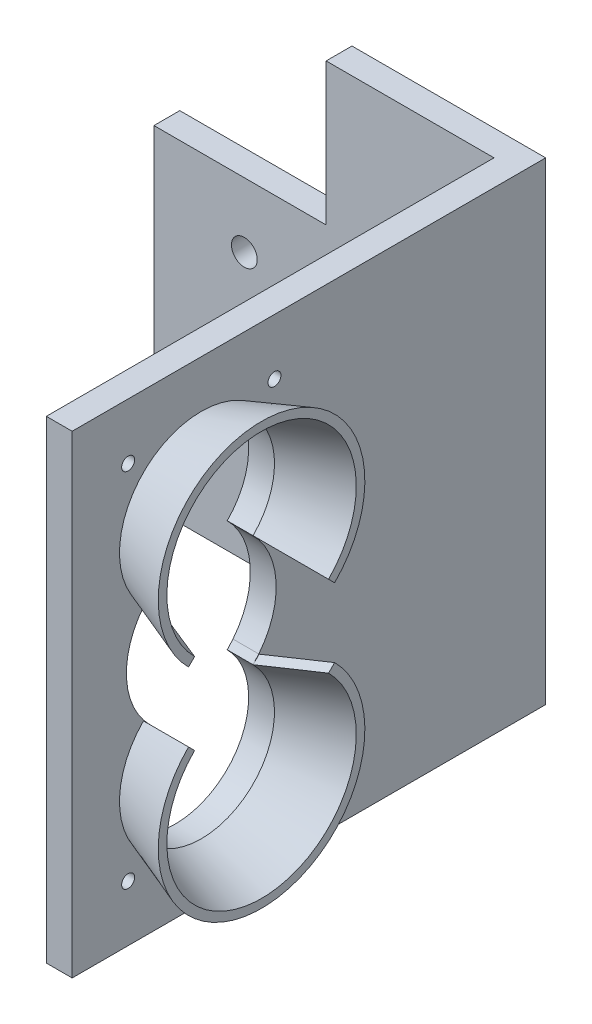
ISO-10303-21;
HEADER;
FILE_DESCRIPTION(('STEP AP214'),'2;1');
FILE_NAME('part.step','',(''),(''),'','','');
FILE_SCHEMA(('AUTOMOTIVE_DESIGN { 1 0 10303 214 1 1 1 1 }'));
ENDSEC;
DATA;
#1=APPLICATION_CONTEXT('core data for automotive mechanical design processes');
#2=APPLICATION_PROTOCOL_DEFINITION('international standard','automotive_design',2000,#1);
#3=PRODUCT_CONTEXT('',#1,'mechanical');
#4=PRODUCT('Part','Part','',(#3));
#5=PRODUCT_RELATED_PRODUCT_CATEGORY('part','',(#4));
#6=PRODUCT_DEFINITION_FORMATION('','',#4);
#7=PRODUCT_DEFINITION_CONTEXT('part definition',#1,'design');
#8=PRODUCT_DEFINITION('design','',#6,#7);
#9=PRODUCT_DEFINITION_SHAPE('','',#8);
#10=(LENGTH_UNIT() NAMED_UNIT(*) SI_UNIT(.MILLI.,.METRE.));
#11=(NAMED_UNIT(*) PLANE_ANGLE_UNIT() SI_UNIT($,.RADIAN.));
#12=(NAMED_UNIT(*) SI_UNIT($,.STERADIAN.) SOLID_ANGLE_UNIT());
#13=UNCERTAINTY_MEASURE_WITH_UNIT(LENGTH_MEASURE(1.E-05),#10,'distance_accuracy_value','');
#14=(GEOMETRIC_REPRESENTATION_CONTEXT(3) GLOBAL_UNCERTAINTY_ASSIGNED_CONTEXT((#13)) GLOBAL_UNIT_ASSIGNED_CONTEXT((#10,
#11,#12)) REPRESENTATION_CONTEXT('',''));
#15=CARTESIAN_POINT('',(0.,0.,0.));
#16=DIRECTION('',(0.,0.,1.));
#17=DIRECTION('',(1.,0.,0.));
#18=AXIS2_PLACEMENT_3D('',#15,#16,#17);
#19=CARTESIAN_POINT('',(-16.6176470588235,27.5,-24.2843137254902));
#20=DIRECTION('',(1.,0.,0.));
#21=DIRECTION('',(0.,0.,-1.));
#22=AXIS2_PLACEMENT_3D('',#19,#20,#21);
#23=PLANE('',#22);
#24=DIRECTION('',(0.,0.,-1.));
#25=VECTOR('',#24,1.);
#26=CARTESIAN_POINT('',(-16.6176470588235,11.,-24.2843137254902));
#27=LINE('',#26,#25);
#28=CARTESIAN_POINT('',(-16.6176470588235,11.,-24.2843137254902));
#29=VERTEX_POINT('',#28);
#30=CARTESIAN_POINT('',(-16.6176470588235,11.,-27.2843137254902));
#31=VERTEX_POINT('',#30);
#32=EDGE_CURVE('E302',#29,#31,#27,.T.);
#33=ORIENTED_EDGE('',*,*,#32,.T.);
#34=DIRECTION('',(0.,-1.,0.));
#35=VECTOR('',#34,1.);
#36=CARTESIAN_POINT('',(-16.6176470588235,27.5,-27.2843137254902));
#37=LINE('',#36,#35);
#38=CARTESIAN_POINT('',(-16.6176470588235,-27.5,-27.2843137254902));
#39=VERTEX_POINT('',#38);
#40=EDGE_CURVE('E490',#31,#39,#37,.T.);
#41=ORIENTED_EDGE('',*,*,#40,.T.);
#42=DIRECTION('',(0.,0.,1.));
#43=VECTOR('',#42,1.);
#44=CARTESIAN_POINT('',(-16.6176470588235,-27.5,-24.2843137254902));
#45=LINE('',#44,#43);
#46=CARTESIAN_POINT('',(-16.6176470588235,-27.5,-24.2843137254902));
#47=VERTEX_POINT('',#46);
#48=EDGE_CURVE('E476',#39,#47,#45,.T.);
#49=ORIENTED_EDGE('',*,*,#48,.T.);
#50=DIRECTION('',(0.,-1.,0.));
#51=VECTOR('',#50,1.);
#52=CARTESIAN_POINT('',(-16.6176470588235,27.5,-24.2843137254902));
#53=LINE('',#52,#51);
#54=EDGE_CURVE('E12',#29,#47,#53,.T.);
#55=ORIENTED_EDGE('',*,*,#54,.F.);
#56=EDGE_LOOP('',(#33,#41,#49,#55));
#57=FACE_BOUND('',#56,.T.);
#58=ADVANCED_FACE('F149',(#57),#23,.F.);
#59=CARTESIAN_POINT('',(0.,27.5,0.));
#60=DIRECTION('',(0.,-1.,0.));
#61=DIRECTION('',(0.,0.,-1.));
#62=AXIS2_PLACEMENT_3D('',#59,#60,#61);
#63=PLANE('',#62);
#64=DIRECTION('',(0.,0.,-1.));
#65=VECTOR('',#64,1.);
#66=CARTESIAN_POINT('',(3.38235294117648,27.5,-24.2843137254902));
#67=LINE('',#66,#65);
#68=CARTESIAN_POINT('',(3.38235294117649,27.5,-24.2843137254902));
#69=VERTEX_POINT('',#68);
#70=CARTESIAN_POINT('',(3.38235294117648,27.5,-27.2843137254902));
#71=VERTEX_POINT('',#70);
#72=EDGE_CURVE('E305',#69,#71,#67,.T.);
#73=ORIENTED_EDGE('',*,*,#72,.F.);
#74=DIRECTION('',(1.,0.,0.));
#75=VECTOR('',#74,1.);
#76=CARTESIAN_POINT('',(22.8823529411765,27.5,-24.2843137254902));
#77=LINE('',#76,#75);
#78=CARTESIAN_POINT('',(22.8823529411765,27.5,-24.2843137254902));
#79=VERTEX_POINT('',#78);
#80=EDGE_CURVE('E316',#69,#79,#77,.T.);
#81=ORIENTED_EDGE('',*,*,#80,.T.);
#82=DIRECTION('',(0.,0.,1.));
#83=VECTOR('',#82,1.);
#84=CARTESIAN_POINT('',(22.8823529411765,27.5,27.7156862745098));
#85=LINE('',#84,#83);
#86=CARTESIAN_POINT('',(22.8823529411765,27.5,27.7156862745098));
#87=VERTEX_POINT('',#86);
#88=EDGE_CURVE('E480',#79,#87,#85,.T.);
#89=ORIENTED_EDGE('',*,*,#88,.T.);
#90=DIRECTION('',(1.,0.,0.));
#91=VECTOR('',#90,1.);
#92=CARTESIAN_POINT('',(25.8823529411765,27.5,27.7156862745098));
#93=LINE('',#92,#91);
#94=CARTESIAN_POINT('',(25.8823529411765,27.5,27.7156862745098));
#95=VERTEX_POINT('',#94);
#96=EDGE_CURVE('E483',#87,#95,#93,.T.);
#97=ORIENTED_EDGE('',*,*,#96,.T.);
#98=DIRECTION('',(0.,0.,-1.));
#99=VECTOR('',#98,1.);
#100=CARTESIAN_POINT('',(25.8823529411765,27.5,-27.2843137254902));
#101=LINE('',#100,#99);
#102=CARTESIAN_POINT('',(25.8823529411765,27.5,-27.2843137254902));
#103=VERTEX_POINT('',#102);
#104=EDGE_CURVE('E485',#95,#103,#101,.T.);
#105=ORIENTED_EDGE('',*,*,#104,.T.);
#106=DIRECTION('',(-1.,0.,0.));
#107=VECTOR('',#106,1.);
#108=CARTESIAN_POINT('',(-16.6176470588235,27.5,-27.2843137254902));
#109=LINE('',#108,#107);
#110=EDGE_CURVE('E487',#103,#71,#109,.T.);
#111=ORIENTED_EDGE('',*,*,#110,.T.);
#112=EDGE_LOOP('',(#73,#81,#89,#97,#105,#111));
#113=FACE_BOUND('',#112,.T.);
#114=ADVANCED_FACE('F537',(#113),#63,.F.);
#115=CARTESIAN_POINT('',(25.8823529411765,27.5,-27.2843137254902));
#116=DIRECTION('',(-1.,0.,0.));
#117=DIRECTION('',(0.,0.,1.));
#118=AXIS2_PLACEMENT_3D('',#115,#116,#117);
#119=PLANE('',#118);
#120=CARTESIAN_POINT('',(25.8823529411765,21.,21.2156862745098));
#121=DIRECTION('',(1.,0.,0.));
#122=DIRECTION('',(0.,0.,-1.));
#123=AXIS2_PLACEMENT_3D('',#120,#121,#122);
#124=CIRCLE('',#123,0.750000000000002);
#125=CARTESIAN_POINT('',(25.8823529411765,21.,20.4656862745098));
#126=VERTEX_POINT('',#125);
#127=EDGE_CURVE('E458',#126,#126,#124,.T.);
#128=ORIENTED_EDGE('',*,*,#127,.F.);
#129=EDGE_LOOP('',(#128));
#130=FACE_BOUND('',#129,.T.);
#131=CARTESIAN_POINT('',(25.8823529411765,21.,4.2156862745098));
#132=DIRECTION('',(1.,0.,0.));
#133=DIRECTION('',(0.,0.,-1.));
#134=AXIS2_PLACEMENT_3D('',#131,#132,#133);
#135=CIRCLE('',#134,0.75);
#136=CARTESIAN_POINT('',(25.8823529411765,21.,3.4656862745098));
#137=VERTEX_POINT('',#136);
#138=EDGE_CURVE('E437',#137,#137,#135,.F.);
#139=ORIENTED_EDGE('',*,*,#138,.T.);
#140=EDGE_LOOP('',(#139));
#141=FACE_BOUND('',#140,.T.);
#142=CARTESIAN_POINT('',(25.8823529411765,-21.,21.2156862745098));
#143=DIRECTION('',(1.,0.,0.));
#144=DIRECTION('',(0.,0.,-1.));
#145=AXIS2_PLACEMENT_3D('',#142,#143,#144);
#146=CIRCLE('',#145,0.750000000000002);
#147=CARTESIAN_POINT('',(25.8823529411765,-21.,20.4656862745098));
#148=VERTEX_POINT('',#147);
#149=EDGE_CURVE('E464',#148,#148,#146,.F.);
#150=ORIENTED_EDGE('',*,*,#149,.T.);
#151=EDGE_LOOP('',(#150));
#152=FACE_BOUND('',#151,.T.);
#153=DIRECTION('',(0.,0.,-1.));
#154=VECTOR('',#153,1.);
#155=CARTESIAN_POINT('',(25.8823529411765,-27.5,-27.2843137254902));
#156=LINE('',#155,#154);
#157=CARTESIAN_POINT('',(25.8823529411765,-27.5,27.7156862745098));
#158=VERTEX_POINT('',#157);
#159=CARTESIAN_POINT('',(25.8823529411765,-27.5,-27.2843137254902));
#160=VERTEX_POINT('',#159);
#161=EDGE_CURVE('E499',#158,#160,#156,.T.);
#162=ORIENTED_EDGE('',*,*,#161,.T.);
#163=DIRECTION('',(0.,-1.,0.));
#164=VECTOR('',#163,1.);
#165=CARTESIAN_POINT('',(25.8823529411765,27.5,-27.2843137254902));
#166=LINE('',#165,#164);
#167=EDGE_CURVE('E504',#103,#160,#166,.T.);
#168=ORIENTED_EDGE('',*,*,#167,.F.);
#169=ORIENTED_EDGE('',*,*,#104,.F.);
#170=DIRECTION('',(0.,-1.,0.));
#171=VECTOR('',#170,1.);
#172=CARTESIAN_POINT('',(25.8823529411765,27.5,27.7156862745098));
#173=LINE('',#172,#171);
#174=EDGE_CURVE('E507',#95,#158,#173,.T.);
#175=ORIENTED_EDGE('',*,*,#174,.T.);
#176=EDGE_LOOP('',(#162,#168,#169,#175));
#177=FACE_BOUND('',#176,.T.);
#178=CARTESIAN_POINT('',(25.8823529411765,-21.,4.2156862745098));
#179=DIRECTION('',(1.,0.,0.));
#180=DIRECTION('',(0.,0.,-1.));
#181=AXIS2_PLACEMENT_3D('',#178,#179,#180);
#182=CIRCLE('',#181,0.75);
#183=CARTESIAN_POINT('',(25.8823529411765,-21.,3.4656862745098));
#184=VERTEX_POINT('',#183);
#185=EDGE_CURVE('E465',#184,#184,#182,.T.);
#186=ORIENTED_EDGE('',*,*,#185,.F.);
#187=EDGE_LOOP('',(#186));
#188=FACE_BOUND('',#187,.T.);
#189=CARTESIAN_POINT('',(25.8823529411765,-12.5,12.7156862745098));
#190=DIRECTION('',(-1.,0.,0.));
#191=DIRECTION('',(0.,-1.,0.));
#192=AXIS2_PLACEMENT_3D('',#189,#190,#191);
#193=CIRCLE('',#192,9.5);
#194=CARTESIAN_POINT('',(25.8823529411765,-5.78248557872775,5.99817185323764));
#195=VERTEX_POINT('',#194);
#196=CARTESIAN_POINT('',(25.8823529411765,-5.78248557872776,19.433200695782));
#197=VERTEX_POINT('',#196);
#198=EDGE_CURVE('E372',#195,#197,#193,.T.);
#199=ORIENTED_EDGE('',*,*,#198,.T.);
#200=DIRECTION('',(0.,0.707106781186551,0.707106781186544));
#201=VECTOR('',#200,1.);
#202=CARTESIAN_POINT('',(25.8823529411765,-21.3388347648319,3.87685150967801));
#203=LINE('',#202,#201);
#204=CARTESIAN_POINT('',(25.8823529411765,-6.48959235991431,18.7260939145954));
#205=VERTEX_POINT('',#204);
#206=EDGE_CURVE('E323',#205,#197,#203,.T.);
#207=ORIENTED_EDGE('',*,*,#206,.F.);
#208=DIRECTION('',(0.,0.744628434388798,0.667479209189086));
#209=VECTOR('',#208,1.);
#210=CARTESIAN_POINT('',(25.8823529411765,-12.1986163895243,13.6085686247462));
#211=LINE('',#210,#209);
#212=CARTESIAN_POINT('',(25.8823529411765,-5.74397055779098,19.3944635709919));
#213=VERTEX_POINT('',#212);
#214=EDGE_CURVE('E391',#205,#213,#211,.T.);
#215=ORIENTED_EDGE('',*,*,#214,.T.);
#216=CARTESIAN_POINT('',(25.8823529411765,1.196959198424E-13,12.236501554681));
#217=DIRECTION('',(1.,0.,0.));
#218=DIRECTION('',(0.,0.,-1.));
#219=AXIS2_PLACEMENT_3D('',#216,#217,#218);
#220=CIRCLE('',#219,9.17766952966388);
#221=CARTESIAN_POINT('',(25.8823529411765,5.74397055779107,19.394463570992));
#222=VERTEX_POINT('',#221);
#223=EDGE_CURVE('E395',#222,#213,#220,.T.);
#224=ORIENTED_EDGE('',*,*,#223,.F.);
#225=DIRECTION('',(0.,-0.744628434388801,0.667479209189083));
#226=VECTOR('',#225,1.);
#227=CARTESIAN_POINT('',(25.8823529411765,12.1986163895244,13.6085686247464));
#228=LINE('',#227,#226);
#229=CARTESIAN_POINT('',(25.8823529411765,6.48959235991446,18.7260939145956));
#230=VERTEX_POINT('',#229);
#231=EDGE_CURVE('E430',#230,#222,#228,.T.);
#232=ORIENTED_EDGE('',*,*,#231,.F.);
#233=DIRECTION('',(0.,-0.707106781186551,0.707106781186544));
#234=VECTOR('',#233,1.);
#235=CARTESIAN_POINT('',(25.8823529411765,21.3388347648319,3.87685150967803));
#236=LINE('',#235,#234);
#237=CARTESIAN_POINT('',(25.8823529411765,5.78248557872775,19.433200695782));
#238=VERTEX_POINT('',#237);
#239=EDGE_CURVE('E348',#230,#238,#236,.T.);
#240=ORIENTED_EDGE('',*,*,#239,.T.);
#241=CARTESIAN_POINT('',(25.8823529411765,12.5,12.7156862745098));
#242=DIRECTION('',(1.,0.,0.));
#243=DIRECTION('',(0.,1.,0.));
#244=AXIS2_PLACEMENT_3D('',#241,#242,#243);
#245=CIRCLE('',#244,9.5);
#246=CARTESIAN_POINT('',(25.8823529411765,5.78248557872775,5.99817185323764));
#247=VERTEX_POINT('',#246);
#248=EDGE_CURVE('E171',#247,#238,#245,.T.);
#249=ORIENTED_EDGE('',*,*,#248,.F.);
#250=DIRECTION('',(0.,-0.707106781186551,-0.707106781186544));
#251=VECTOR('',#250,1.);
#252=CARTESIAN_POINT('',(25.8823529411765,21.3388347648319,21.5545210393416));
#253=LINE('',#252,#251);
#254=CARTESIAN_POINT('',(25.8823529411765,6.48959235991431,6.70527863442419));
#255=VERTEX_POINT('',#254);
#256=EDGE_CURVE('E374',#255,#247,#253,.T.);
#257=ORIENTED_EDGE('',*,*,#256,.F.);
#258=DIRECTION('',(0.,-0.744628434388708,-0.667479209189186));
#259=VECTOR('',#258,1.);
#260=CARTESIAN_POINT('',(25.8823529411765,-0.441386082781654,0.492402794361063));
#261=LINE('',#260,#259);
#262=CARTESIAN_POINT('',(25.8823529411765,5.74397055779077,6.03690897802791));
#263=VERTEX_POINT('',#262);
#264=EDGE_CURVE('E425',#255,#263,#261,.T.);
#265=ORIENTED_EDGE('',*,*,#264,.T.);
#266=CARTESIAN_POINT('',(25.8823529411765,0.,13.1948709943384));
#267=DIRECTION('',(1.,0.,0.));
#268=DIRECTION('',(0.,0.,-1.));
#269=AXIS2_PLACEMENT_3D('',#266,#267,#268);
#270=CIRCLE('',#269,9.17766952966349);
#271=CARTESIAN_POINT('',(25.8823529411765,-5.74397055779096,6.03690897802772));
#272=VERTEX_POINT('',#271);
#273=EDGE_CURVE('E422',#263,#272,#270,.F.);
#274=ORIENTED_EDGE('',*,*,#273,.T.);
#275=DIRECTION('',(0.,0.744628434388815,-0.667479209189067));
#276=VECTOR('',#275,1.);
#277=CARTESIAN_POINT('',(25.8823529411765,0.441386082782281,0.49240279436192));
#278=LINE('',#277,#276);
#279=CARTESIAN_POINT('',(25.8823529411765,-6.48959235991435,6.70527863442414));
#280=VERTEX_POINT('',#279);
#281=EDGE_CURVE('E419',#280,#272,#278,.T.);
#282=ORIENTED_EDGE('',*,*,#281,.F.);
#283=DIRECTION('',(0.,0.707106781186551,-0.707106781186544));
#284=VECTOR('',#283,1.);
#285=CARTESIAN_POINT('',(25.8823529411765,-21.3388347648319,21.5545210393416));
#286=LINE('',#285,#284);
#287=EDGE_CURVE('E358',#280,#195,#286,.T.);
#288=ORIENTED_EDGE('',*,*,#287,.T.);
#289=EDGE_LOOP('',(#199,#207,#215,#224,#232,#240,#249,#257,#265,#274,#282,#288));
#290=FACE_BOUND('',#289,.T.);
#291=ADVANCED_FACE('F532',(#130,#141,#152,#177,#188,#290),#119,.F.);
#292=CARTESIAN_POINT('',(22.8823529411765,27.5,27.7156862745098));
#293=DIRECTION('',(1.,0.,0.));
#294=DIRECTION('',(0.,0.,-1.));
#295=AXIS2_PLACEMENT_3D('',#292,#293,#294);
#296=PLANE('',#295);
#297=CARTESIAN_POINT('',(22.8823529411765,21.,21.2156862745098));
#298=DIRECTION('',(1.,0.,0.));
#299=DIRECTION('',(0.,0.,-1.));
#300=AXIS2_PLACEMENT_3D('',#297,#298,#299);
#301=CIRCLE('',#300,0.750000000000002);
#302=CARTESIAN_POINT('',(22.8823529411765,21.,20.4656862745098));
#303=VERTEX_POINT('',#302);
#304=EDGE_CURVE('E468',#303,#303,#301,.T.);
#305=ORIENTED_EDGE('',*,*,#304,.T.);
#306=EDGE_LOOP('',(#305));
#307=FACE_BOUND('',#306,.T.);
#308=DIRECTION('',(0.,0.744628434388798,0.667479209189086));
#309=VECTOR('',#308,1.);
#310=CARTESIAN_POINT('',(22.8823529411765,-12.1986163895243,13.6085686247462));
#311=LINE('',#310,#309);
#312=CARTESIAN_POINT('',(22.8823529411765,-6.48959235991436,18.7260939145955));
#313=VERTEX_POINT('',#312);
#314=CARTESIAN_POINT('',(22.8823529411765,-5.74397055779098,19.3944635709919));
#315=VERTEX_POINT('',#314);
#316=EDGE_CURVE('E392',#313,#315,#311,.T.);
#317=ORIENTED_EDGE('',*,*,#316,.F.);
#318=CARTESIAN_POINT('',(22.8823529411765,-12.5,12.7156862745098));
#319=DIRECTION('',(1.,0.,0.));
#320=DIRECTION('',(0.,0.,-1.));
#321=AXIS2_PLACEMENT_3D('',#318,#319,#320);
#322=CIRCLE('',#321,8.5);
#323=CARTESIAN_POINT('',(22.8823529411765,-6.48959235991435,6.70527863442414));
#324=VERTEX_POINT('',#323);
#325=EDGE_CURVE('E394',#313,#324,#322,.T.);
#326=ORIENTED_EDGE('',*,*,#325,.T.);
#327=DIRECTION('',(0.,0.744628434388815,-0.667479209189067));
#328=VECTOR('',#327,1.);
#329=CARTESIAN_POINT('',(22.8823529411765,0.441386082782281,0.49240279436192));
#330=LINE('',#329,#328);
#331=CARTESIAN_POINT('',(22.8823529411765,-5.74397055779096,6.03690897802772));
#332=VERTEX_POINT('',#331);
#333=EDGE_CURVE('E398',#324,#332,#330,.T.);
#334=ORIENTED_EDGE('',*,*,#333,.T.);
#335=CARTESIAN_POINT('',(22.8823529411765,0.,13.1948709943384));
#336=DIRECTION('',(1.,0.,0.));
#337=DIRECTION('',(0.,0.,-1.));
#338=AXIS2_PLACEMENT_3D('',#335,#336,#337);
#339=CIRCLE('',#338,9.17766952966349);
#340=CARTESIAN_POINT('',(22.8823529411765,5.74397055779077,6.03690897802791));
#341=VERTEX_POINT('',#340);
#342=EDGE_CURVE('E401',#341,#332,#339,.F.);
#343=ORIENTED_EDGE('',*,*,#342,.F.);
#344=DIRECTION('',(0.,-0.744628434388708,-0.667479209189186));
#345=VECTOR('',#344,1.);
#346=CARTESIAN_POINT('',(22.8823529411765,-0.441386082781654,0.492402794361063));
#347=LINE('',#346,#345);
#348=CARTESIAN_POINT('',(22.8823529411765,6.48959235991406,6.70527863442445));
#349=VERTEX_POINT('',#348);
#350=EDGE_CURVE('E403',#349,#341,#347,.T.);
#351=ORIENTED_EDGE('',*,*,#350,.F.);
#352=CARTESIAN_POINT('',(22.8823529411765,12.5,12.7156862745098));
#353=DIRECTION('',(1.,0.,0.));
#354=DIRECTION('',(0.,0.,-1.));
#355=AXIS2_PLACEMENT_3D('',#352,#353,#354);
#356=CIRCLE('',#355,8.5);
#357=CARTESIAN_POINT('',(22.8823529411765,6.48959235991446,18.7260939145956));
#358=VERTEX_POINT('',#357);
#359=EDGE_CURVE('E405',#349,#358,#356,.T.);
#360=ORIENTED_EDGE('',*,*,#359,.T.);
#361=DIRECTION('',(0.,-0.744628434388801,0.667479209189083));
#362=VECTOR('',#361,1.);
#363=CARTESIAN_POINT('',(22.8823529411765,12.1986163895244,13.6085686247464));
#364=LINE('',#363,#362);
#365=CARTESIAN_POINT('',(22.8823529411765,5.74397055779107,19.394463570992));
#366=VERTEX_POINT('',#365);
#367=EDGE_CURVE('E408',#358,#366,#364,.T.);
#368=ORIENTED_EDGE('',*,*,#367,.T.);
#369=CARTESIAN_POINT('',(22.8823529411765,1.196959198424E-13,12.236501554681));
#370=DIRECTION('',(1.,0.,0.));
#371=DIRECTION('',(0.,0.,-1.));
#372=AXIS2_PLACEMENT_3D('',#369,#370,#371);
#373=CIRCLE('',#372,9.17766952966388);
#374=EDGE_CURVE('E411',#366,#315,#373,.T.);
#375=ORIENTED_EDGE('',*,*,#374,.T.);
#376=EDGE_LOOP('',(#317,#326,#334,#343,#351,#360,#368,#375));
#377=FACE_BOUND('',#376,.T.);
#378=CARTESIAN_POINT('',(22.8823529411765,21.,4.2156862745098));
#379=DIRECTION('',(1.,0.,0.));
#380=DIRECTION('',(0.,0.,-1.));
#381=AXIS2_PLACEMENT_3D('',#378,#379,#380);
#382=CIRCLE('',#381,0.75);
#383=CARTESIAN_POINT('',(22.8823529411765,21.,3.4656862745098));
#384=VERTEX_POINT('',#383);
#385=EDGE_CURVE('E455',#384,#384,#382,.F.);
#386=ORIENTED_EDGE('',*,*,#385,.F.);
#387=EDGE_LOOP('',(#386));
#388=FACE_BOUND('',#387,.T.);
#389=CARTESIAN_POINT('',(22.8823529411765,-21.,21.2156862745098));
#390=DIRECTION('',(1.,0.,0.));
#391=DIRECTION('',(0.,0.,-1.));
#392=AXIS2_PLACEMENT_3D('',#389,#390,#391);
#393=CIRCLE('',#392,0.750000000000002);
#394=CARTESIAN_POINT('',(22.8823529411765,-21.,20.4656862745098));
#395=VERTEX_POINT('',#394);
#396=EDGE_CURVE('E473',#395,#395,#393,.F.);
#397=ORIENTED_EDGE('',*,*,#396,.F.);
#398=EDGE_LOOP('',(#397));
#399=FACE_BOUND('',#398,.T.);
#400=DIRECTION('',(0.,0.,1.));
#401=VECTOR('',#400,1.);
#402=CARTESIAN_POINT('',(22.8823529411765,-27.5,27.7156862745098));
#403=LINE('',#402,#401);
#404=CARTESIAN_POINT('',(22.8823529411765,-27.5,-24.2843137254902));
#405=VERTEX_POINT('',#404);
#406=CARTESIAN_POINT('',(22.8823529411765,-27.5,27.7156862745098));
#407=VERTEX_POINT('',#406);
#408=EDGE_CURVE('E495',#405,#407,#403,.T.);
#409=ORIENTED_EDGE('',*,*,#408,.T.);
#410=DIRECTION('',(0.,-1.,0.));
#411=VECTOR('',#410,1.);
#412=CARTESIAN_POINT('',(22.8823529411765,27.5,27.7156862745098));
#413=LINE('',#412,#411);
#414=EDGE_CURVE('E510',#87,#407,#413,.T.);
#415=ORIENTED_EDGE('',*,*,#414,.F.);
#416=ORIENTED_EDGE('',*,*,#88,.F.);
#417=DIRECTION('',(0.,-1.,0.));
#418=VECTOR('',#417,1.);
#419=CARTESIAN_POINT('',(22.8823529411765,27.5,-24.2843137254902));
#420=LINE('',#419,#418);
#421=EDGE_CURVE('E156',#79,#405,#420,.T.);
#422=ORIENTED_EDGE('',*,*,#421,.T.);
#423=EDGE_LOOP('',(#409,#415,#416,#422));
#424=FACE_BOUND('',#423,.T.);
#425=CARTESIAN_POINT('',(22.8823529411765,-21.,4.2156862745098));
#426=DIRECTION('',(1.,0.,0.));
#427=DIRECTION('',(0.,0.,-1.));
#428=AXIS2_PLACEMENT_3D('',#425,#426,#427);
#429=CIRCLE('',#428,0.75);
#430=CARTESIAN_POINT('',(22.8823529411765,-21.,3.4656862745098));
#431=VERTEX_POINT('',#430);
#432=EDGE_CURVE('E461',#431,#431,#429,.T.);
#433=ORIENTED_EDGE('',*,*,#432,.T.);
#434=EDGE_LOOP('',(#433));
#435=FACE_BOUND('',#434,.T.);
#436=ADVANCED_FACE('F516',(#307,#377,#388,#399,#424,#435),#296,.F.);
#437=CARTESIAN_POINT('',(22.8823529411765,27.5,-24.2843137254902));
#438=DIRECTION('',(0.,0.,-1.));
#439=DIRECTION('',(-1.,0.,0.));
#440=AXIS2_PLACEMENT_3D('',#437,#438,#439);
#441=PLANE('',#440);
#442=DIRECTION('',(1.,0.,0.));
#443=VECTOR('',#442,1.);
#444=CARTESIAN_POINT('',(0.,11.,-24.2843137254902));
#445=LINE('',#444,#443);
#446=CARTESIAN_POINT('',(3.38235294117648,11.,-24.2843137254902));
#447=VERTEX_POINT('',#446);
#448=EDGE_CURVE('E297',#29,#447,#445,.T.);
#449=ORIENTED_EDGE('',*,*,#448,.F.);
#450=ORIENTED_EDGE('',*,*,#54,.T.);
#451=DIRECTION('',(1.,0.,0.));
#452=VECTOR('',#451,1.);
#453=CARTESIAN_POINT('',(22.8823529411765,-27.5,-24.2843137254902));
#454=LINE('',#453,#452);
#455=EDGE_CURVE('E493',#47,#405,#454,.T.);
#456=ORIENTED_EDGE('',*,*,#455,.T.);
#457=ORIENTED_EDGE('',*,*,#421,.F.);
#458=ORIENTED_EDGE('',*,*,#80,.F.);
#459=DIRECTION('',(0.,1.,0.));
#460=VECTOR('',#459,1.);
#461=CARTESIAN_POINT('',(3.38235294117649,0.,-24.2843137254902));
#462=LINE('',#461,#460);
#463=EDGE_CURVE('E163',#447,#69,#462,.T.);
#464=ORIENTED_EDGE('',*,*,#463,.F.);
#465=EDGE_LOOP('',(#449,#450,#456,#457,#458,#464));
#466=FACE_BOUND('',#465,.T.);
#467=CARTESIAN_POINT('',(13.8823529411765,3.5,-24.2843137254902));
#468=DIRECTION('',(0.,0.,-1.));
#469=DIRECTION('',(-1.,0.,0.));
#470=AXIS2_PLACEMENT_3D('',#467,#468,#469);
#471=CIRCLE('',#470,1.5);
#472=CARTESIAN_POINT('',(12.3823529411765,3.5,-24.2843137254902));
#473=VERTEX_POINT('',#472);
#474=EDGE_CURVE('E321',#473,#473,#471,.F.);
#475=ORIENTED_EDGE('',*,*,#474,.F.);
#476=EDGE_LOOP('',(#475));
#477=FACE_BOUND('',#476,.T.);
#478=CARTESIAN_POINT('',(-6.11764705882352,3.5,-24.2843137254902));
#479=DIRECTION('',(0.,0.,-1.));
#480=DIRECTION('',(-1.,0.,0.));
#481=AXIS2_PLACEMENT_3D('',#478,#479,#480);
#482=CIRCLE('',#481,1.5);
#483=CARTESIAN_POINT('',(-7.61764705882352,3.5,-24.2843137254902));
#484=VERTEX_POINT('',#483);
#485=EDGE_CURVE('E331',#484,#484,#482,.F.);
#486=ORIENTED_EDGE('',*,*,#485,.F.);
#487=EDGE_LOOP('',(#486));
#488=FACE_BOUND('',#487,.T.);
#489=ADVANCED_FACE('F313',(#466,#477,#488),#441,.F.);
#490=CARTESIAN_POINT('',(25.8823529411765,27.5,27.7156862745098));
#491=DIRECTION('',(0.,0.,-1.));
#492=DIRECTION('',(-1.,0.,0.));
#493=AXIS2_PLACEMENT_3D('',#490,#491,#492);
#494=PLANE('',#493);
#495=DIRECTION('',(1.,0.,0.));
#496=VECTOR('',#495,1.);
#497=CARTESIAN_POINT('',(25.8823529411765,-27.5,27.7156862745098));
#498=LINE('',#497,#496);
#499=EDGE_CURVE('E497',#407,#158,#498,.T.);
#500=ORIENTED_EDGE('',*,*,#499,.T.);
#501=ORIENTED_EDGE('',*,*,#174,.F.);
#502=ORIENTED_EDGE('',*,*,#96,.F.);
#503=ORIENTED_EDGE('',*,*,#414,.T.);
#504=EDGE_LOOP('',(#500,#501,#502,#503));
#505=FACE_BOUND('',#504,.T.);
#506=ADVANCED_FACE('F528',(#505),#494,.F.);
#507=CARTESIAN_POINT('',(-16.6176470588235,27.5,-27.2843137254902));
#508=DIRECTION('',(0.,0.,1.));
#509=DIRECTION('',(1.,0.,0.));
#510=AXIS2_PLACEMENT_3D('',#507,#508,#509);
#511=PLANE('',#510);
#512=DIRECTION('',(1.,0.,0.));
#513=VECTOR('',#512,1.);
#514=CARTESIAN_POINT('',(0.,11.,-27.2843137254902));
#515=LINE('',#514,#513);
#516=CARTESIAN_POINT('',(3.38235294117648,11.,-27.2843137254902));
#517=VERTEX_POINT('',#516);
#518=EDGE_CURVE('E317',#31,#517,#515,.T.);
#519=ORIENTED_EDGE('',*,*,#518,.T.);
#520=DIRECTION('',(0.,1.,0.));
#521=VECTOR('',#520,1.);
#522=CARTESIAN_POINT('',(3.38235294117649,0.,-27.2843137254902));
#523=LINE('',#522,#521);
#524=EDGE_CURVE('E309',#517,#71,#523,.T.);
#525=ORIENTED_EDGE('',*,*,#524,.T.);
#526=ORIENTED_EDGE('',*,*,#110,.F.);
#527=ORIENTED_EDGE('',*,*,#167,.T.);
#528=DIRECTION('',(-1.,0.,0.));
#529=VECTOR('',#528,1.);
#530=CARTESIAN_POINT('',(-16.6176470588235,-27.5,-27.2843137254902));
#531=LINE('',#530,#529);
#532=EDGE_CURVE('E481',#160,#39,#531,.T.);
#533=ORIENTED_EDGE('',*,*,#532,.T.);
#534=ORIENTED_EDGE('',*,*,#40,.F.);
#535=EDGE_LOOP('',(#519,#525,#526,#527,#533,#534));
#536=FACE_BOUND('',#535,.T.);
#537=CARTESIAN_POINT('',(13.8823529411765,3.5,-27.2843137254902));
#538=DIRECTION('',(0.,0.,-1.));
#539=DIRECTION('',(-1.,0.,0.));
#540=AXIS2_PLACEMENT_3D('',#537,#538,#539);
#541=CIRCLE('',#540,1.5);
#542=CARTESIAN_POINT('',(12.3823529411765,3.5,-27.2843137254902));
#543=VERTEX_POINT('',#542);
#544=EDGE_CURVE('E328',#543,#543,#541,.F.);
#545=ORIENTED_EDGE('',*,*,#544,.T.);
#546=EDGE_LOOP('',(#545));
#547=FACE_BOUND('',#546,.T.);
#548=CARTESIAN_POINT('',(-6.11764705882352,3.5,-27.2843137254902));
#549=DIRECTION('',(0.,0.,-1.));
#550=DIRECTION('',(-1.,0.,0.));
#551=AXIS2_PLACEMENT_3D('',#548,#549,#550);
#552=CIRCLE('',#551,1.5);
#553=CARTESIAN_POINT('',(-7.61764705882352,3.5,-27.2843137254902));
#554=VERTEX_POINT('',#553);
#555=EDGE_CURVE('E334',#554,#554,#552,.F.);
#556=ORIENTED_EDGE('',*,*,#555,.T.);
#557=EDGE_LOOP('',(#556));
#558=FACE_BOUND('',#557,.T.);
#559=ADVANCED_FACE('F539',(#536,#547,#558),#511,.F.);
#560=CARTESIAN_POINT('',(0.,-27.5,0.));
#561=DIRECTION('',(0.,-1.,0.));
#562=DIRECTION('',(0.,0.,-1.));
#563=AXIS2_PLACEMENT_3D('',#560,#561,#562);
#564=PLANE('',#563);
#565=ORIENTED_EDGE('',*,*,#48,.F.);
#566=ORIENTED_EDGE('',*,*,#532,.F.);
#567=ORIENTED_EDGE('',*,*,#161,.F.);
#568=ORIENTED_EDGE('',*,*,#499,.F.);
#569=ORIENTED_EDGE('',*,*,#408,.F.);
#570=ORIENTED_EDGE('',*,*,#455,.F.);
#571=EDGE_LOOP('',(#565,#566,#567,#568,#569,#570));
#572=FACE_BOUND('',#571,.T.);
#573=ADVANCED_FACE('F523',(#572),#564,.T.);
#574=CARTESIAN_POINT('',(22.8823529411765,-21.,21.2156862745098));
#575=DIRECTION('',(1.,0.,0.));
#576=DIRECTION('',(0.,0.,-1.));
#577=AXIS2_PLACEMENT_3D('',#574,#575,#576);
#578=CYLINDRICAL_SURFACE('',#577,0.750000000000002);
#579=ORIENTED_EDGE('',*,*,#396,.T.);
#580=EDGE_LOOP('',(#579));
#581=FACE_BOUND('',#580,.T.);
#582=ORIENTED_EDGE('',*,*,#149,.F.);
#583=EDGE_LOOP('',(#582));
#584=FACE_BOUND('',#583,.T.);
#585=ADVANCED_FACE('F555',(#581,#584),#578,.F.);
#586=CARTESIAN_POINT('',(22.8823529411765,21.,4.2156862745098));
#587=DIRECTION('',(1.,0.,0.));
#588=DIRECTION('',(0.,0.,-1.));
#589=AXIS2_PLACEMENT_3D('',#586,#587,#588);
#590=CYLINDRICAL_SURFACE('',#589,0.75);
#591=ORIENTED_EDGE('',*,*,#385,.T.);
#592=EDGE_LOOP('',(#591));
#593=FACE_BOUND('',#592,.T.);
#594=ORIENTED_EDGE('',*,*,#138,.F.);
#595=EDGE_LOOP('',(#594));
#596=FACE_BOUND('',#595,.T.);
#597=ADVANCED_FACE('F589',(#593,#596),#590,.F.);
#598=CARTESIAN_POINT('',(22.8823529411765,-12.1986163895243,13.6085686247462));
#599=DIRECTION('',(0.,0.667479209189086,-0.744628434388798));
#600=DIRECTION('',(0.,0.744628434388798,0.667479209189086));
#601=AXIS2_PLACEMENT_3D('',#598,#599,#600);
#602=PLANE('',#601);
#603=ORIENTED_EDGE('',*,*,#214,.F.);
#604=DIRECTION('',(1.,0.,0.));
#605=VECTOR('',#604,1.);
#606=CARTESIAN_POINT('',(22.8823529411765,-6.48959235991436,18.7260939145955));
#607=LINE('',#606,#605);
#608=EDGE_CURVE('E414',#313,#205,#607,.T.);
#609=ORIENTED_EDGE('',*,*,#608,.F.);
#610=ORIENTED_EDGE('',*,*,#316,.T.);
#611=DIRECTION('',(1.,0.,0.));
#612=VECTOR('',#611,1.);
#613=CARTESIAN_POINT('',(22.8823529411765,-5.74397055779098,19.3944635709919));
#614=LINE('',#613,#612);
#615=EDGE_CURVE('E435',#315,#213,#614,.T.);
#616=ORIENTED_EDGE('',*,*,#615,.T.);
#617=EDGE_LOOP('',(#603,#609,#610,#616));
#618=FACE_BOUND('',#617,.T.);
#619=ADVANCED_FACE('F596',(#618),#602,.T.);
#620=CARTESIAN_POINT('',(22.8823529411765,1.196959198424E-13,12.236501554681));
#621=DIRECTION('',(1.,0.,0.));
#622=DIRECTION('',(0.,0.,-1.));
#623=AXIS2_PLACEMENT_3D('',#620,#621,#622);
#624=CYLINDRICAL_SURFACE('',#623,9.17766952966388);
#625=ORIENTED_EDGE('',*,*,#223,.T.);
#626=ORIENTED_EDGE('',*,*,#615,.F.);
#627=ORIENTED_EDGE('',*,*,#374,.F.);
#628=DIRECTION('',(1.,0.,0.));
#629=VECTOR('',#628,1.);
#630=CARTESIAN_POINT('',(22.8823529411765,5.74397055779107,19.394463570992));
#631=LINE('',#630,#629);
#632=EDGE_CURVE('E438',#366,#222,#631,.T.);
#633=ORIENTED_EDGE('',*,*,#632,.T.);
#634=EDGE_LOOP('',(#625,#626,#627,#633));
#635=FACE_BOUND('',#634,.T.);
#636=ADVANCED_FACE('F605',(#635),#624,.F.);
#637=CARTESIAN_POINT('',(22.8823529411765,12.1986163895244,13.6085686247464));
#638=DIRECTION('',(0.,0.667479209189082,0.744628434388801));
#639=DIRECTION('',(0.,-0.744628434388801,0.667479209189083));
#640=AXIS2_PLACEMENT_3D('',#637,#638,#639);
#641=PLANE('',#640);
#642=ORIENTED_EDGE('',*,*,#231,.T.);
#643=ORIENTED_EDGE('',*,*,#632,.F.);
#644=ORIENTED_EDGE('',*,*,#367,.F.);
#645=DIRECTION('',(1.,0.,0.));
#646=VECTOR('',#645,1.);
#647=CARTESIAN_POINT('',(22.8823529411765,6.48959235991446,18.7260939145956));
#648=LINE('',#647,#646);
#649=EDGE_CURVE('E440',#358,#230,#648,.T.);
#650=ORIENTED_EDGE('',*,*,#649,.T.);
#651=EDGE_LOOP('',(#642,#643,#644,#650));
#652=FACE_BOUND('',#651,.T.);
#653=ADVANCED_FACE('F614',(#652),#641,.F.);
#654=CARTESIAN_POINT('',(22.8823529411765,12.5,12.7156862745098));
#655=DIRECTION('',(1.,0.,0.));
#656=DIRECTION('',(0.,0.,-1.));
#657=AXIS2_PLACEMENT_3D('',#654,#655,#656);
#658=CYLINDRICAL_SURFACE('',#657,8.5);
#659=CARTESIAN_POINT('',(25.8823529411765,12.5,12.7156862745098));
#660=DIRECTION('',(1.,0.,0.));
#661=DIRECTION('',(0.,0.,-1.));
#662=AXIS2_PLACEMENT_3D('',#659,#660,#661);
#663=CIRCLE('',#662,8.5);
#664=EDGE_CURVE('E428',#255,#230,#663,.T.);
#665=ORIENTED_EDGE('',*,*,#664,.T.);
#666=ORIENTED_EDGE('',*,*,#649,.F.);
#667=ORIENTED_EDGE('',*,*,#359,.F.);
#668=DIRECTION('',(1.,0.,0.));
#669=VECTOR('',#668,1.);
#670=CARTESIAN_POINT('',(22.8823529411765,6.48959235991406,6.70527863442445));
#671=LINE('',#670,#669);
#672=EDGE_CURVE('E443',#349,#255,#671,.T.);
#673=ORIENTED_EDGE('',*,*,#672,.T.);
#674=EDGE_LOOP('',(#665,#666,#667,#673));
#675=FACE_BOUND('',#674,.T.);
#676=ADVANCED_FACE('F623',(#675),#658,.F.);
#677=CARTESIAN_POINT('',(22.8823529411765,-0.441386082781654,0.492402794361063));
#678=DIRECTION('',(0.,-0.667479209189186,0.744628434388708));
#679=DIRECTION('',(0.,-0.744628434388708,-0.667479209189186));
#680=AXIS2_PLACEMENT_3D('',#677,#678,#679);
#681=PLANE('',#680);
#682=ORIENTED_EDGE('',*,*,#264,.F.);
#683=ORIENTED_EDGE('',*,*,#672,.F.);
#684=ORIENTED_EDGE('',*,*,#350,.T.);
#685=DIRECTION('',(1.,0.,0.));
#686=VECTOR('',#685,1.);
#687=CARTESIAN_POINT('',(22.8823529411765,5.74397055779077,6.03690897802791));
#688=LINE('',#687,#686);
#689=EDGE_CURVE('E446',#341,#263,#688,.T.);
#690=ORIENTED_EDGE('',*,*,#689,.T.);
#691=EDGE_LOOP('',(#682,#683,#684,#690));
#692=FACE_BOUND('',#691,.T.);
#693=ADVANCED_FACE('F632',(#692),#681,.T.);
#694=CARTESIAN_POINT('',(22.8823529411765,0.,13.1948709943384));
#695=DIRECTION('',(1.,0.,0.));
#696=DIRECTION('',(0.,0.,-1.));
#697=AXIS2_PLACEMENT_3D('',#694,#695,#696);
#698=CYLINDRICAL_SURFACE('',#697,9.17766952966349);
#699=ORIENTED_EDGE('',*,*,#273,.F.);
#700=ORIENTED_EDGE('',*,*,#689,.F.);
#701=ORIENTED_EDGE('',*,*,#342,.T.);
#702=DIRECTION('',(1.,0.,0.));
#703=VECTOR('',#702,1.);
#704=CARTESIAN_POINT('',(22.8823529411765,-5.74397055779096,6.03690897802772));
#705=LINE('',#704,#703);
#706=EDGE_CURVE('E448',#332,#272,#705,.T.);
#707=ORIENTED_EDGE('',*,*,#706,.T.);
#708=EDGE_LOOP('',(#699,#700,#701,#707));
#709=FACE_BOUND('',#708,.T.);
#710=ADVANCED_FACE('F641',(#709),#698,.F.);
#711=CARTESIAN_POINT('',(22.8823529411765,0.441386082782281,0.49240279436192));
#712=DIRECTION('',(0.,-0.667479209189067,-0.744628434388815));
#713=DIRECTION('',(0.,0.744628434388815,-0.667479209189067));
#714=AXIS2_PLACEMENT_3D('',#711,#712,#713);
#715=PLANE('',#714);
#716=ORIENTED_EDGE('',*,*,#281,.T.);
#717=ORIENTED_EDGE('',*,*,#706,.F.);
#718=ORIENTED_EDGE('',*,*,#333,.F.);
#719=DIRECTION('',(1.,0.,0.));
#720=VECTOR('',#719,1.);
#721=CARTESIAN_POINT('',(22.8823529411765,-6.48959235991435,6.70527863442414));
#722=LINE('',#721,#720);
#723=EDGE_CURVE('E450',#324,#280,#722,.T.);
#724=ORIENTED_EDGE('',*,*,#723,.T.);
#725=EDGE_LOOP('',(#716,#717,#718,#724));
#726=FACE_BOUND('',#725,.T.);
#727=ADVANCED_FACE('F650',(#726),#715,.F.);
#728=CARTESIAN_POINT('',(22.8823529411765,-12.5,12.7156862745098));
#729=DIRECTION('',(1.,0.,0.));
#730=DIRECTION('',(0.,0.,-1.));
#731=AXIS2_PLACEMENT_3D('',#728,#729,#730);
#732=CYLINDRICAL_SURFACE('',#731,8.5);
#733=CARTESIAN_POINT('',(25.8823529411765,-12.5,12.7156862745098));
#734=DIRECTION('',(1.,0.,0.));
#735=DIRECTION('',(0.,0.,-1.));
#736=AXIS2_PLACEMENT_3D('',#733,#734,#735);
#737=CIRCLE('',#736,8.5);
#738=EDGE_CURVE('E417',#205,#280,#737,.T.);
#739=ORIENTED_EDGE('',*,*,#738,.T.);
#740=ORIENTED_EDGE('',*,*,#723,.F.);
#741=ORIENTED_EDGE('',*,*,#325,.F.);
#742=ORIENTED_EDGE('',*,*,#608,.T.);
#743=EDGE_LOOP('',(#739,#740,#741,#742));
#744=FACE_BOUND('',#743,.T.);
#745=ADVANCED_FACE('F659',(#744),#732,.F.);
#746=CARTESIAN_POINT('',(22.8823529411765,21.,21.2156862745098));
#747=DIRECTION('',(1.,0.,0.));
#748=DIRECTION('',(0.,0.,-1.));
#749=AXIS2_PLACEMENT_3D('',#746,#747,#748);
#750=CYLINDRICAL_SURFACE('',#749,0.750000000000002);
#751=ORIENTED_EDGE('',*,*,#304,.F.);
#752=EDGE_LOOP('',(#751));
#753=FACE_BOUND('',#752,.T.);
#754=ORIENTED_EDGE('',*,*,#127,.T.);
#755=EDGE_LOOP('',(#754));
#756=FACE_BOUND('',#755,.T.);
#757=ADVANCED_FACE('F666',(#753,#756),#750,.F.);
#758=CARTESIAN_POINT('',(22.8823529411765,-21.,4.2156862745098));
#759=DIRECTION('',(1.,0.,0.));
#760=DIRECTION('',(0.,0.,-1.));
#761=AXIS2_PLACEMENT_3D('',#758,#759,#760);
#762=CYLINDRICAL_SURFACE('',#761,0.75);
#763=ORIENTED_EDGE('',*,*,#432,.F.);
#764=EDGE_LOOP('',(#763));
#765=FACE_BOUND('',#764,.T.);
#766=ORIENTED_EDGE('',*,*,#185,.T.);
#767=EDGE_LOOP('',(#766));
#768=FACE_BOUND('',#767,.T.);
#769=ADVANCED_FACE('F674',(#765,#768),#762,.F.);
#770=CARTESIAN_POINT('',(25.8823529411765,12.5,12.7156862745098));
#771=DIRECTION('',(1.,0.,0.));
#772=DIRECTION('',(0.,1.,0.));
#773=AXIS2_PLACEMENT_3D('',#770,#771,#772);
#774=CONICAL_SURFACE('',#773,9.5,0.343023940420704);
#775=ORIENTED_EDGE('',*,*,#248,.T.);
#776=DIRECTION('',(0.941741911594837,-0.237825747077249,0.237825747077246));
#777=VECTOR('',#776,1.);
#778=CARTESIAN_POINT('',(-4.0404578120841,13.3391364343679,11.8765498401419));
#779=LINE('',#778,#777);
#780=CARTESIAN_POINT('',(32.8823529411765,4.01471862576137,21.2009676487483));
#781=VERTEX_POINT('',#780);
#782=EDGE_CURVE('E356',#238,#781,#779,.T.);
#783=ORIENTED_EDGE('',*,*,#782,.T.);
#784=CARTESIAN_POINT('',(32.8823529411765,12.5,12.7156862745098));
#785=DIRECTION('',(1.,0.,0.));
#786=DIRECTION('',(0.,1.,0.));
#787=AXIS2_PLACEMENT_3D('',#784,#785,#786);
#788=CIRCLE('',#787,12.);
#789=CARTESIAN_POINT('',(32.8823529411765,4.01471862576137,4.23040490027128));
#790=VERTEX_POINT('',#789);
#791=EDGE_CURVE('E388',#790,#781,#788,.T.);
#792=ORIENTED_EDGE('',*,*,#791,.F.);
#793=DIRECTION('',(0.941741911594837,-0.237825747077249,-0.237825747077246));
#794=VECTOR('',#793,1.);
#795=CARTESIAN_POINT('',(-4.0404578120841,13.3391364343679,13.5548227088777));
#796=LINE('',#795,#794);
#797=EDGE_CURVE('E383',#247,#790,#796,.T.);
#798=ORIENTED_EDGE('',*,*,#797,.F.);
#799=EDGE_LOOP('',(#775,#783,#792,#798));
#800=FACE_BOUND('',#799,.T.);
#801=ADVANCED_FACE('F680',(#800),#774,.T.);
#802=CARTESIAN_POINT('',(32.8823529411765,21.3388347648319,21.5545210393416));
#803=DIRECTION('',(1.,0.,0.));
#804=DIRECTION('',(0.,1.,0.));
#805=AXIS2_PLACEMENT_3D('',#802,#803,#804);
#806=PLANE('',#805);
#807=ORIENTED_EDGE('',*,*,#791,.T.);
#808=DIRECTION('',(0.,-0.707106781186551,0.707106781186544));
#809=VECTOR('',#808,1.);
#810=CARTESIAN_POINT('',(32.8823529411765,21.3388347648319,3.87685150967803));
#811=LINE('',#810,#809);
#812=CARTESIAN_POINT('',(32.8823529411765,4.72182540694792,20.4938608675618));
#813=VERTEX_POINT('',#812);
#814=EDGE_CURVE('E353',#813,#781,#811,.T.);
#815=ORIENTED_EDGE('',*,*,#814,.F.);
#816=CARTESIAN_POINT('',(32.8823529411765,12.5,12.7156862745098));
#817=DIRECTION('',(1.,0.,0.));
#818=DIRECTION('',(0.,1.,0.));
#819=AXIS2_PLACEMENT_3D('',#816,#817,#818);
#820=CIRCLE('',#819,11.);
#821=CARTESIAN_POINT('',(32.8823529411765,4.72182540694792,4.93751168145782));
#822=VERTEX_POINT('',#821);
#823=EDGE_CURVE('E386',#822,#813,#820,.T.);
#824=ORIENTED_EDGE('',*,*,#823,.F.);
#825=DIRECTION('',(0.,-0.707106781186551,-0.707106781186544));
#826=VECTOR('',#825,1.);
#827=CARTESIAN_POINT('',(32.8823529411765,21.3388347648319,21.5545210393416));
#828=LINE('',#827,#826);
#829=EDGE_CURVE('E380',#822,#790,#828,.T.);
#830=ORIENTED_EDGE('',*,*,#829,.T.);
#831=EDGE_LOOP('',(#807,#815,#824,#830));
#832=FACE_BOUND('',#831,.T.);
#833=ADVANCED_FACE('F687',(#832),#806,.T.);
#834=CARTESIAN_POINT('',(25.8823529411765,12.5,12.7156862745098));
#835=DIRECTION('',(1.,0.,0.));
#836=DIRECTION('',(0.,1.,0.));
#837=AXIS2_PLACEMENT_3D('',#834,#835,#836);
#838=CONICAL_SURFACE('',#837,8.49999999999999,0.343023940420704);
#839=ORIENTED_EDGE('',*,*,#823,.T.);
#840=DIRECTION('',(0.941741911594837,-0.23782574707725,0.237825747077247));
#841=VECTOR('',#840,1.);
#842=CARTESIAN_POINT('',(-3.72371573063614,13.9662537606691,11.2494325138407));
#843=LINE('',#842,#841);
#844=EDGE_CURVE('E350',#230,#813,#843,.T.);
#845=ORIENTED_EDGE('',*,*,#844,.F.);
#846=ORIENTED_EDGE('',*,*,#664,.F.);
#847=DIRECTION('',(0.941741911594837,-0.237825747077249,-0.237825747077247));
#848=VECTOR('',#847,1.);
#849=CARTESIAN_POINT('',(-3.72371573063614,13.9662537606691,14.1819400351789));
#850=LINE('',#849,#848);
#851=EDGE_CURVE('E377',#255,#822,#850,.T.);
#852=ORIENTED_EDGE('',*,*,#851,.T.);
#853=EDGE_LOOP('',(#839,#845,#846,#852));
#854=FACE_BOUND('',#853,.T.);
#855=ADVANCED_FACE('F694',(#854),#838,.F.);
#856=CARTESIAN_POINT('',(0.,21.3388347648319,21.5545210393416));
#857=DIRECTION('',(0.,0.707106781186544,-0.707106781186551));
#858=DIRECTION('',(0.,0.707106781186551,0.707106781186544));
#859=AXIS2_PLACEMENT_3D('',#856,#857,#858);
#860=PLANE('',#859);
#861=ORIENTED_EDGE('',*,*,#256,.T.);
#862=ORIENTED_EDGE('',*,*,#797,.T.);
#863=ORIENTED_EDGE('',*,*,#829,.F.);
#864=ORIENTED_EDGE('',*,*,#851,.F.);
#865=EDGE_LOOP('',(#861,#862,#863,#864));
#866=FACE_BOUND('',#865,.T.);
#867=ADVANCED_FACE('F702',(#866),#860,.F.);
#868=CARTESIAN_POINT('',(25.8823529411765,-12.5,12.7156862745098));
#869=DIRECTION('',(1.,0.,0.));
#870=DIRECTION('',(0.,-1.,0.));
#871=AXIS2_PLACEMENT_3D('',#868,#869,#870);
#872=CONICAL_SURFACE('',#871,9.5,0.343023940420704);
#873=CARTESIAN_POINT('',(32.8823529411765,-12.5,12.7156862745098));
#874=DIRECTION('',(-1.,0.,0.));
#875=DIRECTION('',(0.,-1.,0.));
#876=AXIS2_PLACEMENT_3D('',#873,#874,#875);
#877=CIRCLE('',#876,12.);
#878=CARTESIAN_POINT('',(32.8823529411765,-4.01471862576137,4.23040490027128));
#879=VERTEX_POINT('',#878);
#880=CARTESIAN_POINT('',(32.8823529411765,-4.01471862576137,21.2009676487483));
#881=VERTEX_POINT('',#880);
#882=EDGE_CURVE('E370',#879,#881,#877,.T.);
#883=ORIENTED_EDGE('',*,*,#882,.T.);
#884=DIRECTION('',(0.941741911594837,0.237825747077249,0.237825747077246));
#885=VECTOR('',#884,1.);
#886=CARTESIAN_POINT('',(-4.0404578120841,-13.3391364343679,11.8765498401419));
#887=LINE('',#886,#885);
#888=EDGE_CURVE('E345',#197,#881,#887,.T.);
#889=ORIENTED_EDGE('',*,*,#888,.F.);
#890=ORIENTED_EDGE('',*,*,#198,.F.);
#891=DIRECTION('',(0.941741911594837,0.237825747077249,-0.237825747077246));
#892=VECTOR('',#891,1.);
#893=CARTESIAN_POINT('',(-4.0404578120841,-13.3391364343679,13.5548227088777));
#894=LINE('',#893,#892);
#895=EDGE_CURVE('E365',#195,#879,#894,.T.);
#896=ORIENTED_EDGE('',*,*,#895,.T.);
#897=EDGE_LOOP('',(#883,#889,#890,#896));
#898=FACE_BOUND('',#897,.T.);
#899=ADVANCED_FACE('F710',(#898),#872,.T.);
#900=CARTESIAN_POINT('',(32.8823529411765,-21.3388347648319,21.5545210393416));
#901=DIRECTION('',(1.,0.,0.));
#902=DIRECTION('',(0.,-1.,0.));
#903=AXIS2_PLACEMENT_3D('',#900,#901,#902);
#904=PLANE('',#903);
#905=CARTESIAN_POINT('',(32.8823529411765,-12.5,12.7156862745098));
#906=DIRECTION('',(-1.,0.,0.));
#907=DIRECTION('',(0.,-1.,0.));
#908=AXIS2_PLACEMENT_3D('',#905,#906,#907);
#909=CIRCLE('',#908,11.);
#910=CARTESIAN_POINT('',(32.8823529411765,-4.72182540694792,4.93751168145782));
#911=VERTEX_POINT('',#910);
#912=CARTESIAN_POINT('',(32.8823529411765,-4.72182540694792,20.4938608675618));
#913=VERTEX_POINT('',#912);
#914=EDGE_CURVE('E368',#911,#913,#909,.T.);
#915=ORIENTED_EDGE('',*,*,#914,.T.);
#916=DIRECTION('',(0.,0.707106781186551,0.707106781186544));
#917=VECTOR('',#916,1.);
#918=CARTESIAN_POINT('',(32.8823529411765,-21.3388347648319,3.87685150967801));
#919=LINE('',#918,#917);
#920=EDGE_CURVE('E342',#913,#881,#919,.T.);
#921=ORIENTED_EDGE('',*,*,#920,.T.);
#922=ORIENTED_EDGE('',*,*,#882,.F.);
#923=DIRECTION('',(0.,0.707106781186551,-0.707106781186544));
#924=VECTOR('',#923,1.);
#925=CARTESIAN_POINT('',(32.8823529411765,-21.3388347648319,21.5545210393416));
#926=LINE('',#925,#924);
#927=EDGE_CURVE('E363',#911,#879,#926,.T.);
#928=ORIENTED_EDGE('',*,*,#927,.F.);
#929=EDGE_LOOP('',(#915,#921,#922,#928));
#930=FACE_BOUND('',#929,.T.);
#931=ADVANCED_FACE('F717',(#930),#904,.T.);
#932=CARTESIAN_POINT('',(25.8823529411765,-12.5,12.7156862745098));
#933=DIRECTION('',(1.,0.,0.));
#934=DIRECTION('',(0.,-1.,0.));
#935=AXIS2_PLACEMENT_3D('',#932,#933,#934);
#936=CONICAL_SURFACE('',#935,8.49999999999999,0.343023940420704);
#937=DIRECTION('',(0.941741911594837,0.237825747077249,-0.237825747077247));
#938=VECTOR('',#937,1.);
#939=CARTESIAN_POINT('',(-3.72371573063614,-13.9662537606691,14.1819400351789));
#940=LINE('',#939,#938);
#941=EDGE_CURVE('E361',#280,#911,#940,.T.);
#942=ORIENTED_EDGE('',*,*,#941,.F.);
#943=ORIENTED_EDGE('',*,*,#738,.F.);
#944=DIRECTION('',(0.941741911594837,0.237825747077249,0.237825747077247));
#945=VECTOR('',#944,1.);
#946=CARTESIAN_POINT('',(-3.72371573063614,-13.9662537606691,11.2494325138407));
#947=LINE('',#946,#945);
#948=EDGE_CURVE('E339',#205,#913,#947,.T.);
#949=ORIENTED_EDGE('',*,*,#948,.T.);
#950=ORIENTED_EDGE('',*,*,#914,.F.);
#951=EDGE_LOOP('',(#942,#943,#949,#950));
#952=FACE_BOUND('',#951,.T.);
#953=ADVANCED_FACE('F725',(#952),#936,.F.);
#954=CARTESIAN_POINT('',(0.,-21.3388347648319,21.5545210393416));
#955=DIRECTION('',(0.,-0.707106781186544,-0.707106781186551));
#956=DIRECTION('',(0.,-0.707106781186551,0.707106781186544));
#957=AXIS2_PLACEMENT_3D('',#954,#955,#956);
#958=PLANE('',#957);
#959=ORIENTED_EDGE('',*,*,#287,.F.);
#960=ORIENTED_EDGE('',*,*,#941,.T.);
#961=ORIENTED_EDGE('',*,*,#927,.T.);
#962=ORIENTED_EDGE('',*,*,#895,.F.);
#963=EDGE_LOOP('',(#959,#960,#961,#962));
#964=FACE_BOUND('',#963,.T.);
#965=ADVANCED_FACE('F733',(#964),#958,.F.);
#966=CARTESIAN_POINT('',(0.,21.3388347648319,3.87685150967802));
#967=DIRECTION('',(0.,0.707106781186544,0.707106781186551));
#968=DIRECTION('',(0.,0.707106781186551,-0.707106781186544));
#969=AXIS2_PLACEMENT_3D('',#966,#967,#968);
#970=PLANE('',#969);
#971=ORIENTED_EDGE('',*,*,#239,.F.);
#972=ORIENTED_EDGE('',*,*,#844,.T.);
#973=ORIENTED_EDGE('',*,*,#814,.T.);
#974=ORIENTED_EDGE('',*,*,#782,.F.);
#975=EDGE_LOOP('',(#971,#972,#973,#974));
#976=FACE_BOUND('',#975,.T.);
#977=ADVANCED_FACE('F741',(#976),#970,.F.);
#978=CARTESIAN_POINT('',(0.,-21.3388347648319,3.876851509678));
#979=DIRECTION('',(0.,-0.707106781186544,0.707106781186551));
#980=DIRECTION('',(0.,-0.707106781186551,-0.707106781186544));
#981=AXIS2_PLACEMENT_3D('',#978,#979,#980);
#982=PLANE('',#981);
#983=ORIENTED_EDGE('',*,*,#206,.T.);
#984=ORIENTED_EDGE('',*,*,#888,.T.);
#985=ORIENTED_EDGE('',*,*,#920,.F.);
#986=ORIENTED_EDGE('',*,*,#948,.F.);
#987=EDGE_LOOP('',(#983,#984,#985,#986));
#988=FACE_BOUND('',#987,.T.);
#989=ADVANCED_FACE('F748',(#988),#982,.F.);
#990=CARTESIAN_POINT('',(0.,11.,-24.2843137254902));
#991=DIRECTION('',(0.,1.,0.));
#992=DIRECTION('',(0.,0.,1.));
#993=AXIS2_PLACEMENT_3D('',#990,#991,#992);
#994=PLANE('',#993);
#995=ORIENTED_EDGE('',*,*,#518,.F.);
#996=ORIENTED_EDGE('',*,*,#32,.F.);
#997=ORIENTED_EDGE('',*,*,#448,.T.);
#998=DIRECTION('',(0.,0.,-1.));
#999=VECTOR('',#998,1.);
#1000=CARTESIAN_POINT('',(3.38235294117648,11.,-24.2843137254902));
#1001=LINE('',#1000,#999);
#1002=EDGE_CURVE('E299',#447,#517,#1001,.T.);
#1003=ORIENTED_EDGE('',*,*,#1002,.T.);
#1004=EDGE_LOOP('',(#995,#996,#997,#1003));
#1005=FACE_BOUND('',#1004,.T.);
#1006=ADVANCED_FACE('F298',(#1005),#994,.T.);
#1007=CARTESIAN_POINT('',(3.38235294117649,0.,-24.2843137254902));
#1008=DIRECTION('',(-1.,0.,0.));
#1009=DIRECTION('',(0.,-1.,0.));
#1010=AXIS2_PLACEMENT_3D('',#1007,#1008,#1009);
#1011=PLANE('',#1010);
#1012=ORIENTED_EDGE('',*,*,#524,.F.);
#1013=ORIENTED_EDGE('',*,*,#1002,.F.);
#1014=ORIENTED_EDGE('',*,*,#463,.T.);
#1015=ORIENTED_EDGE('',*,*,#72,.T.);
#1016=EDGE_LOOP('',(#1012,#1013,#1014,#1015));
#1017=FACE_BOUND('',#1016,.T.);
#1018=ADVANCED_FACE('F307',(#1017),#1011,.T.);
#1019=CARTESIAN_POINT('',(-6.11764705882352,3.5,-24.2843137254902));
#1020=DIRECTION('',(0.,0.,-1.));
#1021=DIRECTION('',(-1.,0.,0.));
#1022=AXIS2_PLACEMENT_3D('',#1019,#1020,#1021);
#1023=CYLINDRICAL_SURFACE('',#1022,1.5);
#1024=ORIENTED_EDGE('',*,*,#485,.T.);
#1025=EDGE_LOOP('',(#1024));
#1026=FACE_BOUND('',#1025,.T.);
#1027=ORIENTED_EDGE('',*,*,#555,.F.);
#1028=EDGE_LOOP('',(#1027));
#1029=FACE_BOUND('',#1028,.T.);
#1030=ADVANCED_FACE('F767',(#1026,#1029),#1023,.F.);
#1031=CARTESIAN_POINT('',(13.8823529411765,3.5,-24.2843137254902));
#1032=DIRECTION('',(0.,0.,-1.));
#1033=DIRECTION('',(-1.,0.,0.));
#1034=AXIS2_PLACEMENT_3D('',#1031,#1032,#1033);
#1035=CYLINDRICAL_SURFACE('',#1034,1.5);
#1036=ORIENTED_EDGE('',*,*,#474,.T.);
#1037=EDGE_LOOP('',(#1036));
#1038=FACE_BOUND('',#1037,.T.);
#1039=ORIENTED_EDGE('',*,*,#544,.F.);
#1040=EDGE_LOOP('',(#1039));
#1041=FACE_BOUND('',#1040,.T.);
#1042=ADVANCED_FACE('F774',(#1038,#1041),#1035,.F.);
#1043=CLOSED_SHELL('',(#58,#114,#291,#436,#489,#506,#559,#573,#585,#597,#619,#636,#653,#676,
#693,#710,#727,#745,#757,#769,#801,#833,#855,#867,#899,#931,#953,#965,#977,#989,#1006,#1018,
#1030,#1042));
#1044=MANIFOLD_SOLID_BREP('B2',#1043);
#1045=ADVANCED_BREP_SHAPE_REPRESENTATION('',(#18,#1044),#14);
#1046=SHAPE_DEFINITION_REPRESENTATION(#9,#1045);
ENDSEC;
END-ISO-10303-21;
